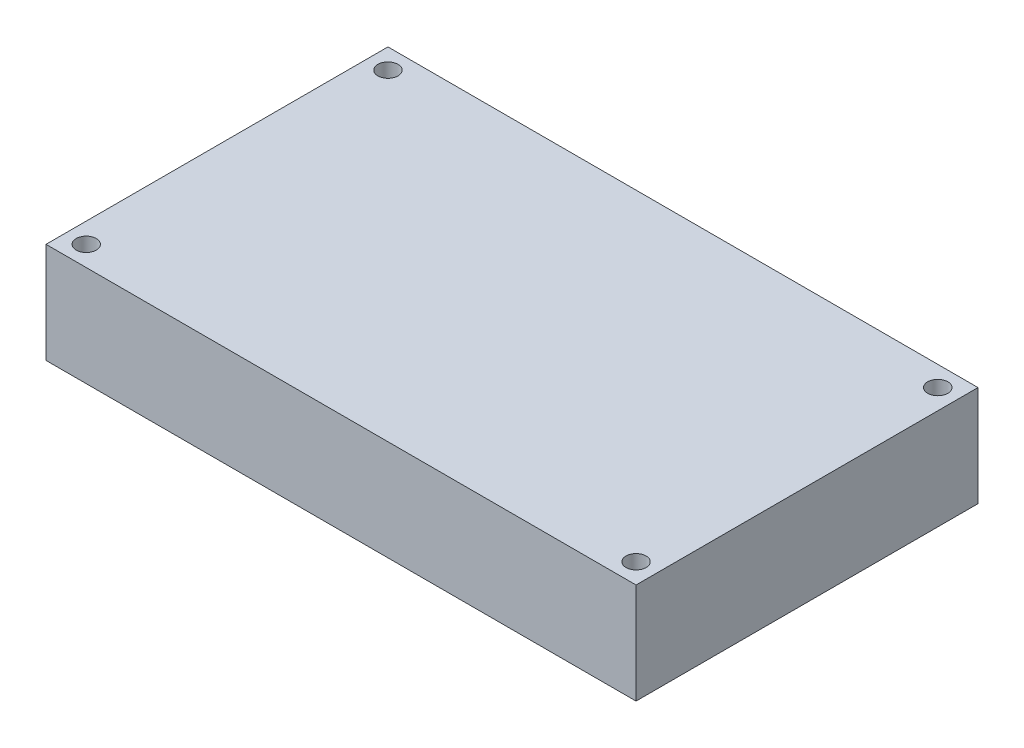
ISO-10303-21;
HEADER;
FILE_DESCRIPTION(('STEP AP214'),'2;1');
FILE_NAME('part.step','',(''),(''),'','','');
FILE_SCHEMA(('AUTOMOTIVE_DESIGN { 1 0 10303 214 1 1 1 1 }'));
ENDSEC;
DATA;
#1=APPLICATION_CONTEXT('core data for automotive mechanical design processes');
#2=APPLICATION_PROTOCOL_DEFINITION('international standard','automotive_design',2000,#1);
#3=PRODUCT_CONTEXT('',#1,'mechanical');
#4=PRODUCT('Part','Part','',(#3));
#5=PRODUCT_RELATED_PRODUCT_CATEGORY('part','',(#4));
#6=PRODUCT_DEFINITION_FORMATION('','',#4);
#7=PRODUCT_DEFINITION_CONTEXT('part definition',#1,'design');
#8=PRODUCT_DEFINITION('design','',#6,#7);
#9=PRODUCT_DEFINITION_SHAPE('','',#8);
#10=(LENGTH_UNIT() NAMED_UNIT(*) SI_UNIT(.MILLI.,.METRE.));
#11=(NAMED_UNIT(*) PLANE_ANGLE_UNIT() SI_UNIT($,.RADIAN.));
#12=(NAMED_UNIT(*) SI_UNIT($,.STERADIAN.) SOLID_ANGLE_UNIT());
#13=UNCERTAINTY_MEASURE_WITH_UNIT(LENGTH_MEASURE(1.E-05),#10,'distance_accuracy_value','');
#14=(GEOMETRIC_REPRESENTATION_CONTEXT(3) GLOBAL_UNCERTAINTY_ASSIGNED_CONTEXT((#13)) GLOBAL_UNIT_ASSIGNED_CONTEXT((#10,
#11,#12)) REPRESENTATION_CONTEXT('',''));
#15=CARTESIAN_POINT('',(0.,0.,0.));
#16=DIRECTION('',(0.,0.,1.));
#17=DIRECTION('',(1.,0.,0.));
#18=AXIS2_PLACEMENT_3D('',#15,#16,#17);
#19=CARTESIAN_POINT('',(-44.,15.,-25.5));
#20=DIRECTION('',(1.,0.,0.));
#21=DIRECTION('',(0.,0.,-1.));
#22=AXIS2_PLACEMENT_3D('',#19,#20,#21);
#23=PLANE('',#22);
#24=DIRECTION('',(0.,0.,1.));
#25=VECTOR('',#24,1.);
#26=CARTESIAN_POINT('',(-44.,0.,-25.5));
#27=LINE('',#26,#25);
#28=CARTESIAN_POINT('',(-44.,0.,-25.5));
#29=VERTEX_POINT('',#28);
#30=CARTESIAN_POINT('',(-44.,0.,25.5));
#31=VERTEX_POINT('',#30);
#32=EDGE_CURVE('E114',#29,#31,#27,.T.);
#33=ORIENTED_EDGE('',*,*,#32,.T.);
#34=DIRECTION('',(0.,-1.,0.));
#35=VECTOR('',#34,1.);
#36=CARTESIAN_POINT('',(-44.,15.,25.5));
#37=LINE('',#36,#35);
#38=CARTESIAN_POINT('',(-44.,15.,25.5));
#39=VERTEX_POINT('',#38);
#40=EDGE_CURVE('E11',#39,#31,#37,.T.);
#41=ORIENTED_EDGE('',*,*,#40,.F.);
#42=DIRECTION('',(0.,0.,1.));
#43=VECTOR('',#42,1.);
#44=CARTESIAN_POINT('',(-44.,15.,-25.5));
#45=LINE('',#44,#43);
#46=CARTESIAN_POINT('',(-44.,15.,-25.5));
#47=VERTEX_POINT('',#46);
#48=EDGE_CURVE('E100',#47,#39,#45,.T.);
#49=ORIENTED_EDGE('',*,*,#48,.F.);
#50=DIRECTION('',(0.,-1.,0.));
#51=VECTOR('',#50,1.);
#52=CARTESIAN_POINT('',(-44.,15.,-25.5));
#53=LINE('',#52,#51);
#54=EDGE_CURVE('E108',#47,#29,#53,.T.);
#55=ORIENTED_EDGE('',*,*,#54,.T.);
#56=EDGE_LOOP('',(#33,#41,#49,#55));
#57=FACE_BOUND('',#56,.T.);
#58=ADVANCED_FACE('F44',(#57),#23,.F.);
#59=CARTESIAN_POINT('',(44.,15.,25.5));
#60=DIRECTION('',(0.,0.,-1.));
#61=DIRECTION('',(-1.,0.,0.));
#62=AXIS2_PLACEMENT_3D('',#59,#60,#61);
#63=PLANE('',#62);
#64=DIRECTION('',(1.,0.,0.));
#65=VECTOR('',#64,1.);
#66=CARTESIAN_POINT('',(44.,0.,25.5));
#67=LINE('',#66,#65);
#68=CARTESIAN_POINT('',(44.,0.,25.5));
#69=VERTEX_POINT('',#68);
#70=EDGE_CURVE('E105',#31,#69,#67,.T.);
#71=ORIENTED_EDGE('',*,*,#70,.T.);
#72=DIRECTION('',(0.,-1.,0.));
#73=VECTOR('',#72,1.);
#74=CARTESIAN_POINT('',(44.,15.,25.5));
#75=LINE('',#74,#73);
#76=CARTESIAN_POINT('',(44.,15.,25.5));
#77=VERTEX_POINT('',#76);
#78=EDGE_CURVE('E53',#77,#69,#75,.T.);
#79=ORIENTED_EDGE('',*,*,#78,.F.);
#80=DIRECTION('',(1.,0.,0.));
#81=VECTOR('',#80,1.);
#82=CARTESIAN_POINT('',(44.,15.,25.5));
#83=LINE('',#82,#81);
#84=EDGE_CURVE('E95',#39,#77,#83,.T.);
#85=ORIENTED_EDGE('',*,*,#84,.F.);
#86=ORIENTED_EDGE('',*,*,#40,.T.);
#87=EDGE_LOOP('',(#71,#79,#85,#86));
#88=FACE_BOUND('',#87,.T.);
#89=ADVANCED_FACE('F101',(#88),#63,.F.);
#90=CARTESIAN_POINT('',(44.,15.,-25.5));
#91=DIRECTION('',(-1.,0.,0.));
#92=DIRECTION('',(0.,0.,1.));
#93=AXIS2_PLACEMENT_3D('',#90,#91,#92);
#94=PLANE('',#93);
#95=DIRECTION('',(0.,0.,-1.));
#96=VECTOR('',#95,1.);
#97=CARTESIAN_POINT('',(44.,0.,-25.5));
#98=LINE('',#97,#96);
#99=CARTESIAN_POINT('',(44.,0.,-25.5));
#100=VERTEX_POINT('',#99);
#101=EDGE_CURVE('E80',#69,#100,#98,.T.);
#102=ORIENTED_EDGE('',*,*,#101,.T.);
#103=DIRECTION('',(0.,-1.,0.));
#104=VECTOR('',#103,1.);
#105=CARTESIAN_POINT('',(44.,15.,-25.5));
#106=LINE('',#105,#104);
#107=CARTESIAN_POINT('',(44.,15.,-25.5));
#108=VERTEX_POINT('',#107);
#109=EDGE_CURVE('E102',#108,#100,#106,.T.);
#110=ORIENTED_EDGE('',*,*,#109,.F.);
#111=DIRECTION('',(0.,0.,-1.));
#112=VECTOR('',#111,1.);
#113=CARTESIAN_POINT('',(44.,15.,-25.5));
#114=LINE('',#113,#112);
#115=EDGE_CURVE('E92',#77,#108,#114,.T.);
#116=ORIENTED_EDGE('',*,*,#115,.F.);
#117=ORIENTED_EDGE('',*,*,#78,.T.);
#118=EDGE_LOOP('',(#102,#110,#116,#117));
#119=FACE_BOUND('',#118,.T.);
#120=ADVANCED_FACE('F104',(#119),#94,.F.);
#121=CARTESIAN_POINT('',(44.,15.,-25.5));
#122=DIRECTION('',(0.,0.,1.));
#123=DIRECTION('',(1.,0.,0.));
#124=AXIS2_PLACEMENT_3D('',#121,#122,#123);
#125=PLANE('',#124);
#126=DIRECTION('',(-1.,0.,0.));
#127=VECTOR('',#126,1.);
#128=CARTESIAN_POINT('',(44.,0.,-25.5));
#129=LINE('',#128,#127);
#130=EDGE_CURVE('E84',#100,#29,#129,.T.);
#131=ORIENTED_EDGE('',*,*,#130,.T.);
#132=ORIENTED_EDGE('',*,*,#54,.F.);
#133=DIRECTION('',(-1.,0.,0.));
#134=VECTOR('',#133,1.);
#135=CARTESIAN_POINT('',(44.,15.,-25.5));
#136=LINE('',#135,#134);
#137=EDGE_CURVE('E64',#108,#47,#136,.T.);
#138=ORIENTED_EDGE('',*,*,#137,.F.);
#139=ORIENTED_EDGE('',*,*,#109,.T.);
#140=EDGE_LOOP('',(#131,#132,#138,#139));
#141=FACE_BOUND('',#140,.T.);
#142=ADVANCED_FACE('F130',(#141),#125,.F.);
#143=CARTESIAN_POINT('',(0.,15.,0.));
#144=DIRECTION('',(0.,-1.,0.));
#145=DIRECTION('',(0.,0.,-1.));
#146=AXIS2_PLACEMENT_3D('',#143,#144,#145);
#147=PLANE('',#146);
#148=CARTESIAN_POINT('',(-41.,15.,-22.5));
#149=DIRECTION('',(0.,-1.,0.));
#150=DIRECTION('',(0.,0.,-1.));
#151=AXIS2_PLACEMENT_3D('',#148,#149,#150);
#152=CIRCLE('',#151,1.5);
#153=CARTESIAN_POINT('',(-41.,15.,-24.));
#154=VERTEX_POINT('',#153);
#155=EDGE_CURVE('E142',#154,#154,#152,.T.);
#156=ORIENTED_EDGE('',*,*,#155,.T.);
#157=EDGE_LOOP('',(#156));
#158=FACE_BOUND('',#157,.T.);
#159=CARTESIAN_POINT('',(41.,15.,-22.5));
#160=DIRECTION('',(0.,-1.,0.));
#161=DIRECTION('',(0.,0.,-1.));
#162=AXIS2_PLACEMENT_3D('',#159,#160,#161);
#163=CIRCLE('',#162,1.5);
#164=CARTESIAN_POINT('',(41.,15.,-24.));
#165=VERTEX_POINT('',#164);
#166=EDGE_CURVE('E147',#165,#165,#163,.T.);
#167=ORIENTED_EDGE('',*,*,#166,.T.);
#168=EDGE_LOOP('',(#167));
#169=FACE_BOUND('',#168,.T.);
#170=CARTESIAN_POINT('',(41.,15.,22.5));
#171=DIRECTION('',(0.,-1.,0.));
#172=DIRECTION('',(0.,0.,-1.));
#173=AXIS2_PLACEMENT_3D('',#170,#171,#172);
#174=CIRCLE('',#173,1.5);
#175=CARTESIAN_POINT('',(41.,15.,21.));
#176=VERTEX_POINT('',#175);
#177=EDGE_CURVE('E158',#176,#176,#174,.T.);
#178=ORIENTED_EDGE('',*,*,#177,.T.);
#179=EDGE_LOOP('',(#178));
#180=FACE_BOUND('',#179,.T.);
#181=CARTESIAN_POINT('',(-41.,15.,22.5));
#182=DIRECTION('',(0.,-1.,0.));
#183=DIRECTION('',(0.,0.,-1.));
#184=AXIS2_PLACEMENT_3D('',#181,#182,#183);
#185=CIRCLE('',#184,1.5);
#186=CARTESIAN_POINT('',(-41.,15.,21.));
#187=VERTEX_POINT('',#186);
#188=EDGE_CURVE('E119',#187,#187,#185,.T.);
#189=ORIENTED_EDGE('',*,*,#188,.T.);
#190=EDGE_LOOP('',(#189));
#191=FACE_BOUND('',#190,.T.);
#192=ORIENTED_EDGE('',*,*,#48,.T.);
#193=ORIENTED_EDGE('',*,*,#84,.T.);
#194=ORIENTED_EDGE('',*,*,#115,.T.);
#195=ORIENTED_EDGE('',*,*,#137,.T.);
#196=EDGE_LOOP('',(#192,#193,#194,#195));
#197=FACE_BOUND('',#196,.T.);
#198=ADVANCED_FACE('F91',(#158,#169,#180,#191,#197),#147,.F.);
#199=CARTESIAN_POINT('',(0.,0.,0.));
#200=DIRECTION('',(0.,-1.,0.));
#201=DIRECTION('',(0.,0.,-1.));
#202=AXIS2_PLACEMENT_3D('',#199,#200,#201);
#203=PLANE('',#202);
#204=CARTESIAN_POINT('',(-41.,0.,-22.5));
#205=DIRECTION('',(0.,-1.,0.));
#206=DIRECTION('',(0.,0.,-1.));
#207=AXIS2_PLACEMENT_3D('',#204,#205,#206);
#208=CIRCLE('',#207,1.5);
#209=CARTESIAN_POINT('',(-41.,0.,-24.));
#210=VERTEX_POINT('',#209);
#211=EDGE_CURVE('E148',#210,#210,#208,.T.);
#212=ORIENTED_EDGE('',*,*,#211,.F.);
#213=EDGE_LOOP('',(#212));
#214=FACE_BOUND('',#213,.T.);
#215=CARTESIAN_POINT('',(41.,0.,-22.5));
#216=DIRECTION('',(0.,-1.,0.));
#217=DIRECTION('',(0.,0.,-1.));
#218=AXIS2_PLACEMENT_3D('',#215,#216,#217);
#219=CIRCLE('',#218,1.5);
#220=CARTESIAN_POINT('',(41.,0.,-24.));
#221=VERTEX_POINT('',#220);
#222=EDGE_CURVE('E152',#221,#221,#219,.T.);
#223=ORIENTED_EDGE('',*,*,#222,.F.);
#224=EDGE_LOOP('',(#223));
#225=FACE_BOUND('',#224,.T.);
#226=CARTESIAN_POINT('',(41.,0.,22.5));
#227=DIRECTION('',(0.,-1.,0.));
#228=DIRECTION('',(0.,0.,-1.));
#229=AXIS2_PLACEMENT_3D('',#226,#227,#228);
#230=CIRCLE('',#229,1.5);
#231=CARTESIAN_POINT('',(41.,0.,21.));
#232=VERTEX_POINT('',#231);
#233=EDGE_CURVE('E137',#232,#232,#230,.T.);
#234=ORIENTED_EDGE('',*,*,#233,.F.);
#235=EDGE_LOOP('',(#234));
#236=FACE_BOUND('',#235,.T.);
#237=CARTESIAN_POINT('',(-41.,0.,22.5));
#238=DIRECTION('',(0.,-1.,0.));
#239=DIRECTION('',(0.,0.,-1.));
#240=AXIS2_PLACEMENT_3D('',#237,#238,#239);
#241=CIRCLE('',#240,1.5);
#242=CARTESIAN_POINT('',(-41.,0.,21.));
#243=VERTEX_POINT('',#242);
#244=EDGE_CURVE('E135',#243,#243,#241,.T.);
#245=ORIENTED_EDGE('',*,*,#244,.F.);
#246=EDGE_LOOP('',(#245));
#247=FACE_BOUND('',#246,.T.);
#248=ORIENTED_EDGE('',*,*,#32,.F.);
#249=ORIENTED_EDGE('',*,*,#130,.F.);
#250=ORIENTED_EDGE('',*,*,#101,.F.);
#251=ORIENTED_EDGE('',*,*,#70,.F.);
#252=EDGE_LOOP('',(#248,#249,#250,#251));
#253=FACE_BOUND('',#252,.T.);
#254=ADVANCED_FACE('F128',(#214,#225,#236,#247,#253),#203,.T.);
#255=CARTESIAN_POINT('',(-41.,15.,22.5));
#256=DIRECTION('',(0.,-1.,0.));
#257=DIRECTION('',(0.,0.,-1.));
#258=AXIS2_PLACEMENT_3D('',#255,#256,#257);
#259=CYLINDRICAL_SURFACE('',#258,1.5);
#260=ORIENTED_EDGE('',*,*,#188,.F.);
#261=EDGE_LOOP('',(#260));
#262=FACE_BOUND('',#261,.T.);
#263=ORIENTED_EDGE('',*,*,#244,.T.);
#264=EDGE_LOOP('',(#263));
#265=FACE_BOUND('',#264,.T.);
#266=ADVANCED_FACE('F168',(#262,#265),#259,.F.);
#267=CARTESIAN_POINT('',(41.,15.,22.5));
#268=DIRECTION('',(0.,-1.,0.));
#269=DIRECTION('',(0.,0.,-1.));
#270=AXIS2_PLACEMENT_3D('',#267,#268,#269);
#271=CYLINDRICAL_SURFACE('',#270,1.5);
#272=ORIENTED_EDGE('',*,*,#177,.F.);
#273=EDGE_LOOP('',(#272));
#274=FACE_BOUND('',#273,.T.);
#275=ORIENTED_EDGE('',*,*,#233,.T.);
#276=EDGE_LOOP('',(#275));
#277=FACE_BOUND('',#276,.T.);
#278=ADVANCED_FACE('F167',(#274,#277),#271,.F.);
#279=CARTESIAN_POINT('',(41.,15.,-22.5));
#280=DIRECTION('',(0.,-1.,0.));
#281=DIRECTION('',(0.,0.,-1.));
#282=AXIS2_PLACEMENT_3D('',#279,#280,#281);
#283=CYLINDRICAL_SURFACE('',#282,1.5);
#284=ORIENTED_EDGE('',*,*,#166,.F.);
#285=EDGE_LOOP('',(#284));
#286=FACE_BOUND('',#285,.T.);
#287=ORIENTED_EDGE('',*,*,#222,.T.);
#288=EDGE_LOOP('',(#287));
#289=FACE_BOUND('',#288,.T.);
#290=ADVANCED_FACE('F182',(#286,#289),#283,.F.);
#291=CARTESIAN_POINT('',(-41.,15.,-22.5));
#292=DIRECTION('',(0.,-1.,0.));
#293=DIRECTION('',(0.,0.,-1.));
#294=AXIS2_PLACEMENT_3D('',#291,#292,#293);
#295=CYLINDRICAL_SURFACE('',#294,1.5);
#296=ORIENTED_EDGE('',*,*,#155,.F.);
#297=EDGE_LOOP('',(#296));
#298=FACE_BOUND('',#297,.T.);
#299=ORIENTED_EDGE('',*,*,#211,.T.);
#300=EDGE_LOOP('',(#299));
#301=FACE_BOUND('',#300,.T.);
#302=ADVANCED_FACE('F209',(#298,#301),#295,.F.);
#303=CLOSED_SHELL('',(#58,#89,#120,#142,#198,#254,#266,#278,#290,#302));
#304=MANIFOLD_SOLID_BREP('B2',#303);
#305=ADVANCED_BREP_SHAPE_REPRESENTATION('',(#18,#304),#14);
#306=SHAPE_DEFINITION_REPRESENTATION(#9,#305);
ENDSEC;
END-ISO-10303-21;
